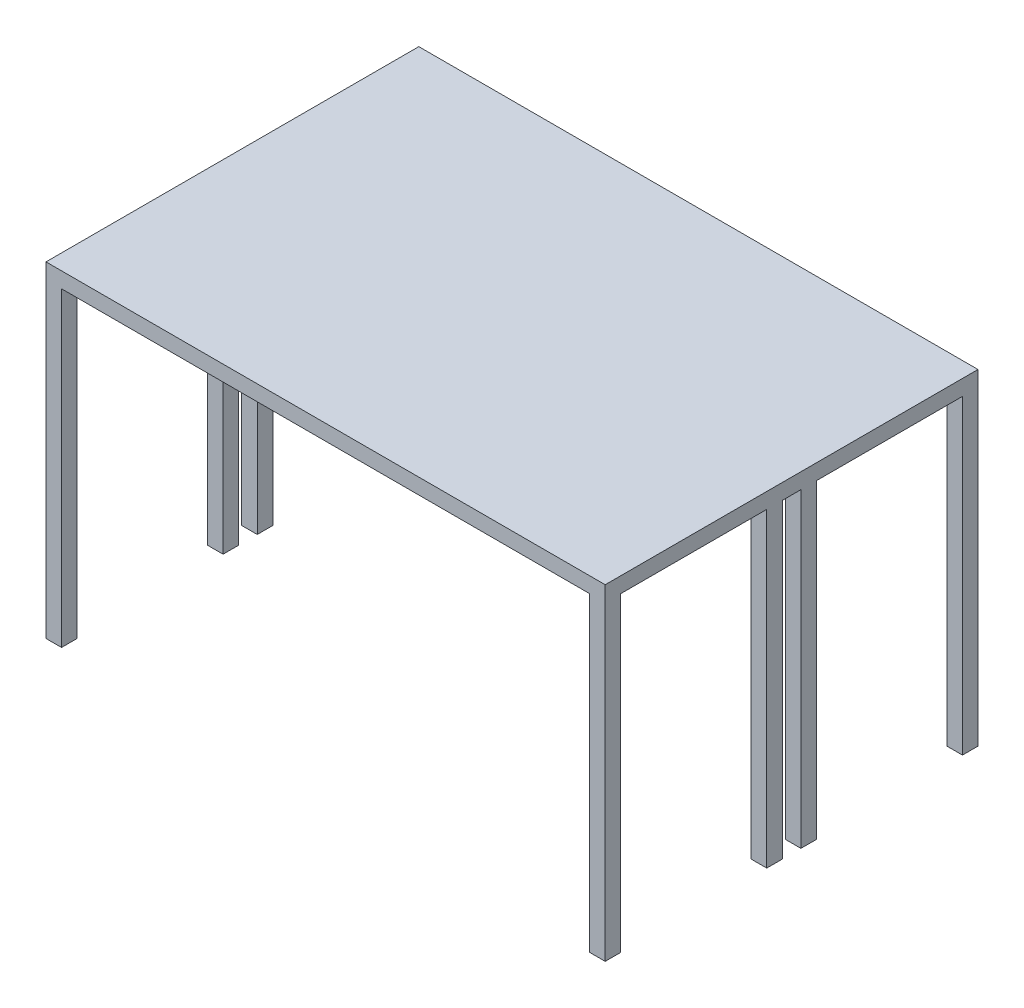
ISO-10303-21;
HEADER;
FILE_DESCRIPTION(('STEP AP214'),'2;1');
FILE_NAME('part.step','',(''),(''),'','','');
FILE_SCHEMA(('AUTOMOTIVE_DESIGN { 1 0 10303 214 1 1 1 1 }'));
ENDSEC;
DATA;
#1=APPLICATION_CONTEXT('core data for automotive mechanical design processes');
#2=APPLICATION_PROTOCOL_DEFINITION('international standard','automotive_design',2000,#1);
#3=PRODUCT_CONTEXT('',#1,'mechanical');
#4=PRODUCT('Part','Part','',(#3));
#5=PRODUCT_RELATED_PRODUCT_CATEGORY('part','',(#4));
#6=PRODUCT_DEFINITION_FORMATION('','',#4);
#7=PRODUCT_DEFINITION_CONTEXT('part definition',#1,'design');
#8=PRODUCT_DEFINITION('design','',#6,#7);
#9=PRODUCT_DEFINITION_SHAPE('','',#8);
#10=(LENGTH_UNIT() NAMED_UNIT(*) SI_UNIT(.MILLI.,.METRE.));
#11=(NAMED_UNIT(*) PLANE_ANGLE_UNIT() SI_UNIT($,.RADIAN.));
#12=(NAMED_UNIT(*) SI_UNIT($,.STERADIAN.) SOLID_ANGLE_UNIT());
#13=UNCERTAINTY_MEASURE_WITH_UNIT(LENGTH_MEASURE(1.E-05),#10,'distance_accuracy_value','');
#14=(GEOMETRIC_REPRESENTATION_CONTEXT(3) GLOBAL_UNCERTAINTY_ASSIGNED_CONTEXT((#13)) GLOBAL_UNIT_ASSIGNED_CONTEXT((#10,
#11,#12)) REPRESENTATION_CONTEXT('',''));
#15=CARTESIAN_POINT('',(0.,0.,0.));
#16=DIRECTION('',(0.,0.,1.));
#17=DIRECTION('',(1.,0.,0.));
#18=AXIS2_PLACEMENT_3D('',#15,#16,#17);
#19=CARTESIAN_POINT('',(0.,0.,0.));
#20=DIRECTION('',(0.,1.,0.));
#21=DIRECTION('',(0.,0.,1.));
#22=AXIS2_PLACEMENT_3D('',#19,#20,#21);
#23=PLANE('',#22);
#24=DIRECTION('',(-1.,0.,0.));
#25=VECTOR('',#24,1.);
#26=CARTESIAN_POINT('',(900.,0.,79.9999999999994));
#27=LINE('',#26,#25);
#28=CARTESIAN_POINT('',(900.,0.,79.9999999999994));
#29=VERTEX_POINT('',#28);
#30=CARTESIAN_POINT('',(850.,0.,79.9999999999994));
#31=VERTEX_POINT('',#30);
#32=EDGE_CURVE('E802',#29,#31,#27,.T.);
#33=ORIENTED_EDGE('',*,*,#32,.F.);
#34=DIRECTION('',(0.,0.,-1.));
#35=VECTOR('',#34,1.);
#36=CARTESIAN_POINT('',(900.,0.,-600.));
#37=LINE('',#36,#35);
#38=CARTESIAN_POINT('',(900.,0.,550.));
#39=VERTEX_POINT('',#38);
#40=EDGE_CURVE('E262',#39,#29,#37,.T.);
#41=ORIENTED_EDGE('',*,*,#40,.F.);
#42=DIRECTION('',(1.,0.,0.));
#43=VECTOR('',#42,1.);
#44=CARTESIAN_POINT('',(900.,0.,550.));
#45=LINE('',#44,#43);
#46=CARTESIAN_POINT('',(850.,0.,550.));
#47=VERTEX_POINT('',#46);
#48=EDGE_CURVE('E350',#47,#39,#45,.T.);
#49=ORIENTED_EDGE('',*,*,#48,.F.);
#50=DIRECTION('',(0.,0.,-1.));
#51=VECTOR('',#50,1.);
#52=CARTESIAN_POINT('',(850.,0.,600.));
#53=LINE('',#52,#51);
#54=CARTESIAN_POINT('',(850.,0.,600.));
#55=VERTEX_POINT('',#54);
#56=EDGE_CURVE('E345',#55,#47,#53,.T.);
#57=ORIENTED_EDGE('',*,*,#56,.F.);
#58=DIRECTION('',(1.,0.,0.));
#59=VECTOR('',#58,1.);
#60=CARTESIAN_POINT('',(-900.,0.,600.));
#61=LINE('',#60,#59);
#62=CARTESIAN_POINT('',(-850.,0.,600.));
#63=VERTEX_POINT('',#62);
#64=EDGE_CURVE('E441',#63,#55,#61,.T.);
#65=ORIENTED_EDGE('',*,*,#64,.F.);
#66=DIRECTION('',(0.,0.,1.));
#67=VECTOR('',#66,1.);
#68=CARTESIAN_POINT('',(-850.,0.,600.));
#69=LINE('',#68,#67);
#70=CARTESIAN_POINT('',(-850.,0.,550.));
#71=VERTEX_POINT('',#70);
#72=EDGE_CURVE('E371',#71,#63,#69,.T.);
#73=ORIENTED_EDGE('',*,*,#72,.F.);
#74=DIRECTION('',(1.,0.,0.));
#75=VECTOR('',#74,1.);
#76=CARTESIAN_POINT('',(-900.,0.,550.));
#77=LINE('',#76,#75);
#78=CARTESIAN_POINT('',(-900.,0.,550.));
#79=VERTEX_POINT('',#78);
#80=EDGE_CURVE('E366',#79,#71,#77,.T.);
#81=ORIENTED_EDGE('',*,*,#80,.F.);
#82=DIRECTION('',(0.,0.,1.));
#83=VECTOR('',#82,1.);
#84=CARTESIAN_POINT('',(-900.,0.,-600.));
#85=LINE('',#84,#83);
#86=CARTESIAN_POINT('',(-900.,0.,79.9999999999994));
#87=VERTEX_POINT('',#86);
#88=EDGE_CURVE('E453',#87,#79,#85,.T.);
#89=ORIENTED_EDGE('',*,*,#88,.F.);
#90=DIRECTION('',(-1.,0.,0.));
#91=VECTOR('',#90,1.);
#92=CARTESIAN_POINT('',(-900.,0.,79.9999999999994));
#93=LINE('',#92,#91);
#94=CARTESIAN_POINT('',(-850.,0.,79.9999999999994));
#95=VERTEX_POINT('',#94);
#96=EDGE_CURVE('E298',#95,#87,#93,.T.);
#97=ORIENTED_EDGE('',*,*,#96,.F.);
#98=DIRECTION('',(0.,0.,1.));
#99=VECTOR('',#98,1.);
#100=CARTESIAN_POINT('',(-850.,0.,29.9999999999994));
#101=LINE('',#100,#99);
#102=CARTESIAN_POINT('',(-850.,0.,29.9999999999994));
#103=VERTEX_POINT('',#102);
#104=EDGE_CURVE('E307',#103,#95,#101,.T.);
#105=ORIENTED_EDGE('',*,*,#104,.F.);
#106=DIRECTION('',(1.,0.,0.));
#107=VECTOR('',#106,1.);
#108=CARTESIAN_POINT('',(-900.,0.,29.9999999999994));
#109=LINE('',#108,#107);
#110=CARTESIAN_POINT('',(-900.,0.,29.9999999999994));
#111=VERTEX_POINT('',#110);
#112=EDGE_CURVE('E293',#111,#103,#109,.T.);
#113=ORIENTED_EDGE('',*,*,#112,.F.);
#114=CARTESIAN_POINT('',(-900.,0.,-29.9999999999999));
#115=VERTEX_POINT('',#114);
#116=EDGE_CURVE('E457',#115,#111,#85,.T.);
#117=ORIENTED_EDGE('',*,*,#116,.F.);
#118=DIRECTION('',(-1.,0.,0.));
#119=VECTOR('',#118,1.);
#120=CARTESIAN_POINT('',(-900.,0.,-29.9999999999999));
#121=LINE('',#120,#119);
#122=CARTESIAN_POINT('',(-850.,0.,-29.9999999999999));
#123=VERTEX_POINT('',#122);
#124=EDGE_CURVE('E324',#123,#115,#121,.T.);
#125=ORIENTED_EDGE('',*,*,#124,.F.);
#126=DIRECTION('',(0.,0.,1.));
#127=VECTOR('',#126,1.);
#128=CARTESIAN_POINT('',(-850.,0.,-29.9999999999999));
#129=LINE('',#128,#127);
#130=CARTESIAN_POINT('',(-850.,0.,-79.9999999999999));
#131=VERTEX_POINT('',#130);
#132=EDGE_CURVE('E332',#131,#123,#129,.T.);
#133=ORIENTED_EDGE('',*,*,#132,.F.);
#134=DIRECTION('',(1.,0.,0.));
#135=VECTOR('',#134,1.);
#136=CARTESIAN_POINT('',(-900.,0.,-79.9999999999999));
#137=LINE('',#136,#135);
#138=CARTESIAN_POINT('',(-900.,0.,-79.9999999999999));
#139=VERTEX_POINT('',#138);
#140=EDGE_CURVE('E319',#139,#131,#137,.T.);
#141=ORIENTED_EDGE('',*,*,#140,.F.);
#142=CARTESIAN_POINT('',(-900.,0.,-550.));
#143=VERTEX_POINT('',#142);
#144=EDGE_CURVE('E454',#143,#139,#85,.T.);
#145=ORIENTED_EDGE('',*,*,#144,.F.);
#146=DIRECTION('',(-1.,0.,0.));
#147=VECTOR('',#146,1.);
#148=CARTESIAN_POINT('',(-900.,0.,-550.));
#149=LINE('',#148,#147);
#150=CARTESIAN_POINT('',(-850.,0.,-550.));
#151=VERTEX_POINT('',#150);
#152=EDGE_CURVE('E394',#151,#143,#149,.T.);
#153=ORIENTED_EDGE('',*,*,#152,.F.);
#154=DIRECTION('',(0.,0.,1.));
#155=VECTOR('',#154,1.);
#156=CARTESIAN_POINT('',(-850.,0.,-600.));
#157=LINE('',#156,#155);
#158=CARTESIAN_POINT('',(-850.,0.,-600.));
#159=VERTEX_POINT('',#158);
#160=EDGE_CURVE('E389',#159,#151,#157,.T.);
#161=ORIENTED_EDGE('',*,*,#160,.F.);
#162=DIRECTION('',(-1.,0.,0.));
#163=VECTOR('',#162,1.);
#164=CARTESIAN_POINT('',(-900.,0.,-600.));
#165=LINE('',#164,#163);
#166=CARTESIAN_POINT('',(850.,0.,-600.));
#167=VERTEX_POINT('',#166);
#168=EDGE_CURVE('E449',#167,#159,#165,.T.);
#169=ORIENTED_EDGE('',*,*,#168,.F.);
#170=DIRECTION('',(0.,0.,-1.));
#171=VECTOR('',#170,1.);
#172=CARTESIAN_POINT('',(850.,0.,-600.));
#173=LINE('',#172,#171);
#174=CARTESIAN_POINT('',(850.,0.,-550.));
#175=VERTEX_POINT('',#174);
#176=EDGE_CURVE('E416',#175,#167,#173,.T.);
#177=ORIENTED_EDGE('',*,*,#176,.F.);
#178=DIRECTION('',(-1.,0.,0.));
#179=VECTOR('',#178,1.);
#180=CARTESIAN_POINT('',(900.,0.,-550.));
#181=LINE('',#180,#179);
#182=CARTESIAN_POINT('',(900.,0.,-550.));
#183=VERTEX_POINT('',#182);
#184=EDGE_CURVE('E411',#183,#175,#181,.T.);
#185=ORIENTED_EDGE('',*,*,#184,.F.);
#186=CARTESIAN_POINT('',(900.,0.,-79.9999999999998));
#187=VERTEX_POINT('',#186);
#188=EDGE_CURVE('E436',#187,#183,#37,.T.);
#189=ORIENTED_EDGE('',*,*,#188,.F.);
#190=DIRECTION('',(1.,0.,0.));
#191=VECTOR('',#190,1.);
#192=CARTESIAN_POINT('',(900.,0.,-79.9999999999999));
#193=LINE('',#192,#191);
#194=CARTESIAN_POINT('',(850.,0.,-79.9999999999999));
#195=VERTEX_POINT('',#194);
#196=EDGE_CURVE('E276',#195,#187,#193,.T.);
#197=ORIENTED_EDGE('',*,*,#196,.F.);
#198=DIRECTION('',(0.,0.,-1.));
#199=VECTOR('',#198,1.);
#200=CARTESIAN_POINT('',(850.,0.,-29.9999999999999));
#201=LINE('',#200,#199);
#202=CARTESIAN_POINT('',(850.,0.,-29.9999999999999));
#203=VERTEX_POINT('',#202);
#204=EDGE_CURVE('E266',#203,#195,#201,.T.);
#205=ORIENTED_EDGE('',*,*,#204,.F.);
#206=DIRECTION('',(-1.,0.,0.));
#207=VECTOR('',#206,1.);
#208=CARTESIAN_POINT('',(900.,0.,-29.9999999999999));
#209=LINE('',#208,#207);
#210=CARTESIAN_POINT('',(900.,0.,-29.9999999999999));
#211=VERTEX_POINT('',#210);
#212=EDGE_CURVE('E263',#211,#203,#209,.T.);
#213=ORIENTED_EDGE('',*,*,#212,.F.);
#214=CARTESIAN_POINT('',(900.,0.,29.9999999999995));
#215=VERTEX_POINT('',#214);
#216=EDGE_CURVE('E450',#215,#211,#37,.T.);
#217=ORIENTED_EDGE('',*,*,#216,.F.);
#218=DIRECTION('',(1.,0.,0.));
#219=VECTOR('',#218,1.);
#220=CARTESIAN_POINT('',(900.,0.,29.9999999999994));
#221=LINE('',#220,#219);
#222=CARTESIAN_POINT('',(850.,0.,29.9999999999994));
#223=VERTEX_POINT('',#222);
#224=EDGE_CURVE('E257',#223,#215,#221,.T.);
#225=ORIENTED_EDGE('',*,*,#224,.F.);
#226=DIRECTION('',(0.,0.,-1.));
#227=VECTOR('',#226,1.);
#228=CARTESIAN_POINT('',(850.,0.,29.9999999999994));
#229=LINE('',#228,#227);
#230=EDGE_CURVE('E777',#31,#223,#229,.T.);
#231=ORIENTED_EDGE('',*,*,#230,.F.);
#232=EDGE_LOOP('',(#33,#41,#49,#57,#65,#73,#81,#89,#97,#105,#113,#117,#125,#133,#141,#145,#153,
#161,#169,#177,#185,#189,#197,#205,#213,#217,#225,#231));
#233=FACE_BOUND('',#232,.T.);
#234=ADVANCED_FACE('F33',(#233),#23,.F.);
#235=CARTESIAN_POINT('',(900.,50.,-600.));
#236=DIRECTION('',(-1.,0.,0.));
#237=DIRECTION('',(0.,0.,1.));
#238=AXIS2_PLACEMENT_3D('',#235,#236,#237);
#239=PLANE('',#238);
#240=DIRECTION('',(0.,-1.,0.));
#241=VECTOR('',#240,1.);
#242=CARTESIAN_POINT('',(900.,50.,600.));
#243=LINE('',#242,#241);
#244=CARTESIAN_POINT('',(900.,50.,600.));
#245=VERTEX_POINT('',#244);
#246=CARTESIAN_POINT('',(900.,-1000.,600.));
#247=VERTEX_POINT('',#246);
#248=EDGE_CURVE('E447',#245,#247,#243,.T.);
#249=ORIENTED_EDGE('',*,*,#248,.T.);
#250=DIRECTION('',(0.,0.,1.));
#251=VECTOR('',#250,1.);
#252=CARTESIAN_POINT('',(900.,-1000.,600.));
#253=LINE('',#252,#251);
#254=CARTESIAN_POINT('',(900.,-1000.,550.));
#255=VERTEX_POINT('',#254);
#256=EDGE_CURVE('E354',#255,#247,#253,.T.);
#257=ORIENTED_EDGE('',*,*,#256,.F.);
#258=DIRECTION('',(0.,1.,0.));
#259=VECTOR('',#258,1.);
#260=CARTESIAN_POINT('',(900.,-1000.,550.));
#261=LINE('',#260,#259);
#262=EDGE_CURVE('E357',#255,#39,#261,.T.);
#263=ORIENTED_EDGE('',*,*,#262,.T.);
#264=ORIENTED_EDGE('',*,*,#40,.T.);
#265=DIRECTION('',(0.,1.,0.));
#266=VECTOR('',#265,1.);
#267=CARTESIAN_POINT('',(900.,-1000.,79.9999999999994));
#268=LINE('',#267,#266);
#269=CARTESIAN_POINT('',(900.,-1000.,79.9999999999994));
#270=VERTEX_POINT('',#269);
#271=EDGE_CURVE('E245',#270,#29,#268,.T.);
#272=ORIENTED_EDGE('',*,*,#271,.F.);
#273=DIRECTION('',(0.,0.,1.));
#274=VECTOR('',#273,1.);
#275=CARTESIAN_POINT('',(900.,-1000.,29.9999999999994));
#276=LINE('',#275,#274);
#277=CARTESIAN_POINT('',(900.,-1000.,29.9999999999994));
#278=VERTEX_POINT('',#277);
#279=EDGE_CURVE('E252',#278,#270,#276,.T.);
#280=ORIENTED_EDGE('',*,*,#279,.F.);
#281=DIRECTION('',(0.,1.,0.));
#282=VECTOR('',#281,1.);
#283=CARTESIAN_POINT('',(900.,-1000.,29.9999999999994));
#284=LINE('',#283,#282);
#285=EDGE_CURVE('E48',#278,#215,#284,.T.);
#286=ORIENTED_EDGE('',*,*,#285,.T.);
#287=ORIENTED_EDGE('',*,*,#216,.T.);
#288=DIRECTION('',(0.,1.,0.));
#289=VECTOR('',#288,1.);
#290=CARTESIAN_POINT('',(900.,-1000.,-29.9999999999999));
#291=LINE('',#290,#289);
#292=CARTESIAN_POINT('',(900.,-1000.,-29.9999999999999));
#293=VERTEX_POINT('',#292);
#294=EDGE_CURVE('E281',#293,#211,#291,.T.);
#295=ORIENTED_EDGE('',*,*,#294,.F.);
#296=DIRECTION('',(0.,0.,1.));
#297=VECTOR('',#296,1.);
#298=CARTESIAN_POINT('',(900.,-1000.,-29.9999999999999));
#299=LINE('',#298,#297);
#300=CARTESIAN_POINT('',(900.,-1000.,-79.9999999999999));
#301=VERTEX_POINT('',#300);
#302=EDGE_CURVE('E280',#301,#293,#299,.T.);
#303=ORIENTED_EDGE('',*,*,#302,.F.);
#304=DIRECTION('',(0.,1.,0.));
#305=VECTOR('',#304,1.);
#306=CARTESIAN_POINT('',(900.,-1000.,-79.9999999999999));
#307=LINE('',#306,#305);
#308=EDGE_CURVE('E55',#301,#187,#307,.T.);
#309=ORIENTED_EDGE('',*,*,#308,.T.);
#310=ORIENTED_EDGE('',*,*,#188,.T.);
#311=DIRECTION('',(0.,1.,0.));
#312=VECTOR('',#311,1.);
#313=CARTESIAN_POINT('',(900.,-1000.,-550.));
#314=LINE('',#313,#312);
#315=CARTESIAN_POINT('',(900.,-1000.,-550.));
#316=VERTEX_POINT('',#315);
#317=EDGE_CURVE('E433',#316,#183,#314,.T.);
#318=ORIENTED_EDGE('',*,*,#317,.F.);
#319=DIRECTION('',(0.,0.,1.));
#320=VECTOR('',#319,1.);
#321=CARTESIAN_POINT('',(900.,-1000.,-600.));
#322=LINE('',#321,#320);
#323=CARTESIAN_POINT('',(900.,-1000.,-600.));
#324=VERTEX_POINT('',#323);
#325=EDGE_CURVE('E412',#324,#316,#322,.T.);
#326=ORIENTED_EDGE('',*,*,#325,.F.);
#327=DIRECTION('',(0.,-1.,0.));
#328=VECTOR('',#327,1.);
#329=CARTESIAN_POINT('',(900.,50.,-600.));
#330=LINE('',#329,#328);
#331=CARTESIAN_POINT('',(900.,50.,-600.));
#332=VERTEX_POINT('',#331);
#333=EDGE_CURVE('E11',#332,#324,#330,.T.);
#334=ORIENTED_EDGE('',*,*,#333,.F.);
#335=DIRECTION('',(0.,0.,-1.));
#336=VECTOR('',#335,1.);
#337=CARTESIAN_POINT('',(900.,50.,-600.));
#338=LINE('',#337,#336);
#339=EDGE_CURVE('E437',#245,#332,#338,.T.);
#340=ORIENTED_EDGE('',*,*,#339,.F.);
#341=EDGE_LOOP('',(#249,#257,#263,#264,#272,#280,#286,#287,#295,#303,#309,#310,#318,#326,#334,#340));
#342=FACE_BOUND('',#341,.T.);
#343=ADVANCED_FACE('F35',(#342),#239,.F.);
#344=CARTESIAN_POINT('',(-900.,50.,-600.));
#345=DIRECTION('',(0.,0.,1.));
#346=DIRECTION('',(1.,0.,0.));
#347=AXIS2_PLACEMENT_3D('',#344,#345,#346);
#348=PLANE('',#347);
#349=ORIENTED_EDGE('',*,*,#333,.T.);
#350=DIRECTION('',(1.,0.,0.));
#351=VECTOR('',#350,1.);
#352=CARTESIAN_POINT('',(900.,-1000.,-600.));
#353=LINE('',#352,#351);
#354=CARTESIAN_POINT('',(850.,-1000.,-600.));
#355=VERTEX_POINT('',#354);
#356=EDGE_CURVE('E420',#355,#324,#353,.T.);
#357=ORIENTED_EDGE('',*,*,#356,.F.);
#358=DIRECTION('',(0.,1.,0.));
#359=VECTOR('',#358,1.);
#360=CARTESIAN_POINT('',(850.,-1000.,-600.));
#361=LINE('',#360,#359);
#362=EDGE_CURVE('E423',#355,#167,#361,.T.);
#363=ORIENTED_EDGE('',*,*,#362,.T.);
#364=ORIENTED_EDGE('',*,*,#168,.T.);
#365=DIRECTION('',(0.,1.,0.));
#366=VECTOR('',#365,1.);
#367=CARTESIAN_POINT('',(-850.,-1000.,-600.));
#368=LINE('',#367,#366);
#369=CARTESIAN_POINT('',(-850.,-1000.,-600.));
#370=VERTEX_POINT('',#369);
#371=EDGE_CURVE('E409',#370,#159,#368,.T.);
#372=ORIENTED_EDGE('',*,*,#371,.F.);
#373=DIRECTION('',(1.,0.,0.));
#374=VECTOR('',#373,1.);
#375=CARTESIAN_POINT('',(-900.,-1000.,-600.));
#376=LINE('',#375,#374);
#377=CARTESIAN_POINT('',(-900.,-1000.,-600.));
#378=VERTEX_POINT('',#377);
#379=EDGE_CURVE('E390',#378,#370,#376,.T.);
#380=ORIENTED_EDGE('',*,*,#379,.F.);
#381=DIRECTION('',(0.,-1.,0.));
#382=VECTOR('',#381,1.);
#383=CARTESIAN_POINT('',(-900.,50.,-600.));
#384=LINE('',#383,#382);
#385=CARTESIAN_POINT('',(-900.,50.,-600.));
#386=VERTEX_POINT('',#385);
#387=EDGE_CURVE('E41',#386,#378,#384,.T.);
#388=ORIENTED_EDGE('',*,*,#387,.F.);
#389=DIRECTION('',(-1.,0.,0.));
#390=VECTOR('',#389,1.);
#391=CARTESIAN_POINT('',(-900.,50.,-600.));
#392=LINE('',#391,#390);
#393=EDGE_CURVE('E440',#332,#386,#392,.T.);
#394=ORIENTED_EDGE('',*,*,#393,.F.);
#395=EDGE_LOOP('',(#349,#357,#363,#364,#372,#380,#388,#394));
#396=FACE_BOUND('',#395,.T.);
#397=ADVANCED_FACE('F475',(#396),#348,.F.);
#398=CARTESIAN_POINT('',(-900.,50.,-600.));
#399=DIRECTION('',(1.,0.,0.));
#400=DIRECTION('',(0.,0.,-1.));
#401=AXIS2_PLACEMENT_3D('',#398,#399,#400);
#402=PLANE('',#401);
#403=ORIENTED_EDGE('',*,*,#387,.T.);
#404=DIRECTION('',(0.,0.,-1.));
#405=VECTOR('',#404,1.);
#406=CARTESIAN_POINT('',(-900.,-1000.,-600.));
#407=LINE('',#406,#405);
#408=CARTESIAN_POINT('',(-900.,-1000.,-550.));
#409=VERTEX_POINT('',#408);
#410=EDGE_CURVE('E398',#409,#378,#407,.T.);
#411=ORIENTED_EDGE('',*,*,#410,.F.);
#412=DIRECTION('',(0.,1.,0.));
#413=VECTOR('',#412,1.);
#414=CARTESIAN_POINT('',(-900.,-1000.,-550.));
#415=LINE('',#414,#413);
#416=EDGE_CURVE('E401',#409,#143,#415,.T.);
#417=ORIENTED_EDGE('',*,*,#416,.T.);
#418=ORIENTED_EDGE('',*,*,#144,.T.);
#419=DIRECTION('',(0.,1.,0.));
#420=VECTOR('',#419,1.);
#421=CARTESIAN_POINT('',(-900.,-1000.,-79.9999999999999));
#422=LINE('',#421,#420);
#423=CARTESIAN_POINT('',(-900.,-1000.,-79.9999999999999));
#424=VERTEX_POINT('',#423);
#425=EDGE_CURVE('E343',#424,#139,#422,.T.);
#426=ORIENTED_EDGE('',*,*,#425,.F.);
#427=DIRECTION('',(0.,0.,-1.));
#428=VECTOR('',#427,1.);
#429=CARTESIAN_POINT('',(-900.,-1000.,-29.9999999999999));
#430=LINE('',#429,#428);
#431=CARTESIAN_POINT('',(-900.,-1000.,-29.9999999999999));
#432=VERTEX_POINT('',#431);
#433=EDGE_CURVE('E320',#432,#424,#430,.T.);
#434=ORIENTED_EDGE('',*,*,#433,.F.);
#435=DIRECTION('',(0.,1.,0.));
#436=VECTOR('',#435,1.);
#437=CARTESIAN_POINT('',(-900.,-1000.,-29.9999999999999));
#438=LINE('',#437,#436);
#439=EDGE_CURVE('E330',#432,#115,#438,.T.);
#440=ORIENTED_EDGE('',*,*,#439,.T.);
#441=ORIENTED_EDGE('',*,*,#116,.T.);
#442=DIRECTION('',(0.,1.,0.));
#443=VECTOR('',#442,1.);
#444=CARTESIAN_POINT('',(-900.,-1000.,29.9999999999994));
#445=LINE('',#444,#443);
#446=CARTESIAN_POINT('',(-900.,-1000.,29.9999999999994));
#447=VERTEX_POINT('',#446);
#448=EDGE_CURVE('E304',#447,#111,#445,.T.);
#449=ORIENTED_EDGE('',*,*,#448,.F.);
#450=DIRECTION('',(0.,0.,-1.));
#451=VECTOR('',#450,1.);
#452=CARTESIAN_POINT('',(-900.,-1000.,29.9999999999994));
#453=LINE('',#452,#451);
#454=CARTESIAN_POINT('',(-900.,-1000.,79.9999999999994));
#455=VERTEX_POINT('',#454);
#456=EDGE_CURVE('E302',#455,#447,#453,.T.);
#457=ORIENTED_EDGE('',*,*,#456,.F.);
#458=DIRECTION('',(0.,1.,0.));
#459=VECTOR('',#458,1.);
#460=CARTESIAN_POINT('',(-900.,-1000.,79.9999999999994));
#461=LINE('',#460,#459);
#462=EDGE_CURVE('E312',#455,#87,#461,.T.);
#463=ORIENTED_EDGE('',*,*,#462,.T.);
#464=ORIENTED_EDGE('',*,*,#88,.T.);
#465=DIRECTION('',(0.,1.,0.));
#466=VECTOR('',#465,1.);
#467=CARTESIAN_POINT('',(-900.,-1000.,550.));
#468=LINE('',#467,#466);
#469=CARTESIAN_POINT('',(-900.,-1000.,550.));
#470=VERTEX_POINT('',#469);
#471=EDGE_CURVE('E386',#470,#79,#468,.T.);
#472=ORIENTED_EDGE('',*,*,#471,.F.);
#473=DIRECTION('',(0.,0.,-1.));
#474=VECTOR('',#473,1.);
#475=CARTESIAN_POINT('',(-900.,-1000.,600.));
#476=LINE('',#475,#474);
#477=CARTESIAN_POINT('',(-900.,-1000.,600.));
#478=VERTEX_POINT('',#477);
#479=EDGE_CURVE('E367',#478,#470,#476,.T.);
#480=ORIENTED_EDGE('',*,*,#479,.F.);
#481=DIRECTION('',(0.,-1.,0.));
#482=VECTOR('',#481,1.);
#483=CARTESIAN_POINT('',(-900.,50.,600.));
#484=LINE('',#483,#482);
#485=CARTESIAN_POINT('',(-900.,50.,600.));
#486=VERTEX_POINT('',#485);
#487=EDGE_CURVE('E461',#486,#478,#484,.T.);
#488=ORIENTED_EDGE('',*,*,#487,.F.);
#489=DIRECTION('',(0.,0.,1.));
#490=VECTOR('',#489,1.);
#491=CARTESIAN_POINT('',(-900.,50.,-600.));
#492=LINE('',#491,#490);
#493=EDGE_CURVE('E443',#386,#486,#492,.T.);
#494=ORIENTED_EDGE('',*,*,#493,.F.);
#495=EDGE_LOOP('',(#403,#411,#417,#418,#426,#434,#440,#441,#449,#457,#463,#464,#472,#480,#488,#494));
#496=FACE_BOUND('',#495,.T.);
#497=ADVANCED_FACE('F466',(#496),#402,.F.);
#498=CARTESIAN_POINT('',(-900.,50.,600.));
#499=DIRECTION('',(0.,0.,-1.));
#500=DIRECTION('',(-1.,0.,0.));
#501=AXIS2_PLACEMENT_3D('',#498,#499,#500);
#502=PLANE('',#501);
#503=ORIENTED_EDGE('',*,*,#487,.T.);
#504=DIRECTION('',(-1.,0.,0.));
#505=VECTOR('',#504,1.);
#506=CARTESIAN_POINT('',(-900.,-1000.,600.));
#507=LINE('',#506,#505);
#508=CARTESIAN_POINT('',(-850.,-1000.,600.));
#509=VERTEX_POINT('',#508);
#510=EDGE_CURVE('E375',#509,#478,#507,.T.);
#511=ORIENTED_EDGE('',*,*,#510,.F.);
#512=DIRECTION('',(0.,1.,0.));
#513=VECTOR('',#512,1.);
#514=CARTESIAN_POINT('',(-850.,-1000.,600.));
#515=LINE('',#514,#513);
#516=EDGE_CURVE('E378',#509,#63,#515,.T.);
#517=ORIENTED_EDGE('',*,*,#516,.T.);
#518=ORIENTED_EDGE('',*,*,#64,.T.);
#519=DIRECTION('',(0.,1.,0.));
#520=VECTOR('',#519,1.);
#521=CARTESIAN_POINT('',(850.,-1000.,600.));
#522=LINE('',#521,#520);
#523=CARTESIAN_POINT('',(850.,-1000.,600.));
#524=VERTEX_POINT('',#523);
#525=EDGE_CURVE('E364',#524,#55,#522,.T.);
#526=ORIENTED_EDGE('',*,*,#525,.F.);
#527=DIRECTION('',(-1.,0.,0.));
#528=VECTOR('',#527,1.);
#529=CARTESIAN_POINT('',(900.,-1000.,600.));
#530=LINE('',#529,#528);
#531=EDGE_CURVE('E346',#247,#524,#530,.T.);
#532=ORIENTED_EDGE('',*,*,#531,.F.);
#533=ORIENTED_EDGE('',*,*,#248,.F.);
#534=DIRECTION('',(1.,0.,0.));
#535=VECTOR('',#534,1.);
#536=CARTESIAN_POINT('',(-900.,50.,600.));
#537=LINE('',#536,#535);
#538=EDGE_CURVE('E445',#486,#245,#537,.T.);
#539=ORIENTED_EDGE('',*,*,#538,.F.);
#540=EDGE_LOOP('',(#503,#511,#517,#518,#526,#532,#533,#539));
#541=FACE_BOUND('',#540,.T.);
#542=ADVANCED_FACE('F524',(#541),#502,.F.);
#543=CARTESIAN_POINT('',(0.,50.,0.));
#544=DIRECTION('',(0.,1.,0.));
#545=DIRECTION('',(0.,0.,1.));
#546=AXIS2_PLACEMENT_3D('',#543,#544,#545);
#547=PLANE('',#546);
#548=ORIENTED_EDGE('',*,*,#339,.T.);
#549=ORIENTED_EDGE('',*,*,#393,.T.);
#550=ORIENTED_EDGE('',*,*,#493,.T.);
#551=ORIENTED_EDGE('',*,*,#538,.T.);
#552=EDGE_LOOP('',(#548,#549,#550,#551));
#553=FACE_BOUND('',#552,.T.);
#554=ADVANCED_FACE('F522',(#553),#547,.T.);
#555=CARTESIAN_POINT('',(900.,-1000.,-550.));
#556=DIRECTION('',(0.,0.,-1.));
#557=DIRECTION('',(-1.,0.,0.));
#558=AXIS2_PLACEMENT_3D('',#555,#556,#557);
#559=PLANE('',#558);
#560=ORIENTED_EDGE('',*,*,#184,.T.);
#561=DIRECTION('',(0.,1.,0.));
#562=VECTOR('',#561,1.);
#563=CARTESIAN_POINT('',(850.,-1000.,-550.));
#564=LINE('',#563,#562);
#565=CARTESIAN_POINT('',(850.,-1000.,-550.));
#566=VERTEX_POINT('',#565);
#567=EDGE_CURVE('E430',#566,#175,#564,.T.);
#568=ORIENTED_EDGE('',*,*,#567,.F.);
#569=DIRECTION('',(-1.,0.,0.));
#570=VECTOR('',#569,1.);
#571=CARTESIAN_POINT('',(900.,-1000.,-550.));
#572=LINE('',#571,#570);
#573=EDGE_CURVE('E415',#316,#566,#572,.T.);
#574=ORIENTED_EDGE('',*,*,#573,.F.);
#575=ORIENTED_EDGE('',*,*,#317,.T.);
#576=EDGE_LOOP('',(#560,#568,#574,#575));
#577=FACE_BOUND('',#576,.T.);
#578=ADVANCED_FACE('F549',(#577),#559,.F.);
#579=CARTESIAN_POINT('',(850.,-1000.,-600.));
#580=DIRECTION('',(1.,0.,0.));
#581=DIRECTION('',(0.,0.,-1.));
#582=AXIS2_PLACEMENT_3D('',#579,#580,#581);
#583=PLANE('',#582);
#584=ORIENTED_EDGE('',*,*,#176,.T.);
#585=ORIENTED_EDGE('',*,*,#362,.F.);
#586=DIRECTION('',(0.,0.,-1.));
#587=VECTOR('',#586,1.);
#588=CARTESIAN_POINT('',(850.,-1000.,-600.));
#589=LINE('',#588,#587);
#590=EDGE_CURVE('E418',#566,#355,#589,.T.);
#591=ORIENTED_EDGE('',*,*,#590,.F.);
#592=ORIENTED_EDGE('',*,*,#567,.T.);
#593=EDGE_LOOP('',(#584,#585,#591,#592));
#594=FACE_BOUND('',#593,.T.);
#595=ADVANCED_FACE('F555',(#594),#583,.F.);
#596=CARTESIAN_POINT('',(0.,-1000.,0.));
#597=DIRECTION('',(0.,-1.,0.));
#598=DIRECTION('',(0.,0.,-1.));
#599=AXIS2_PLACEMENT_3D('',#596,#597,#598);
#600=PLANE('',#599);
#601=ORIENTED_EDGE('',*,*,#325,.T.);
#602=ORIENTED_EDGE('',*,*,#573,.T.);
#603=ORIENTED_EDGE('',*,*,#590,.T.);
#604=ORIENTED_EDGE('',*,*,#356,.T.);
#605=EDGE_LOOP('',(#601,#602,#603,#604));
#606=FACE_BOUND('',#605,.T.);
#607=ADVANCED_FACE('F562',(#606),#600,.T.);
#608=CARTESIAN_POINT('',(-850.,-1000.,-600.));
#609=DIRECTION('',(-1.,0.,0.));
#610=DIRECTION('',(0.,0.,1.));
#611=AXIS2_PLACEMENT_3D('',#608,#609,#610);
#612=PLANE('',#611);
#613=ORIENTED_EDGE('',*,*,#160,.T.);
#614=DIRECTION('',(0.,1.,0.));
#615=VECTOR('',#614,1.);
#616=CARTESIAN_POINT('',(-850.,-1000.,-550.));
#617=LINE('',#616,#615);
#618=CARTESIAN_POINT('',(-850.,-1000.,-550.));
#619=VERTEX_POINT('',#618);
#620=EDGE_CURVE('E406',#619,#151,#617,.T.);
#621=ORIENTED_EDGE('',*,*,#620,.F.);
#622=DIRECTION('',(0.,0.,1.));
#623=VECTOR('',#622,1.);
#624=CARTESIAN_POINT('',(-850.,-1000.,-600.));
#625=LINE('',#624,#623);
#626=EDGE_CURVE('E393',#370,#619,#625,.T.);
#627=ORIENTED_EDGE('',*,*,#626,.F.);
#628=ORIENTED_EDGE('',*,*,#371,.T.);
#629=EDGE_LOOP('',(#613,#621,#627,#628));
#630=FACE_BOUND('',#629,.T.);
#631=ADVANCED_FACE('F478',(#630),#612,.F.);
#632=CARTESIAN_POINT('',(-900.,-1000.,-550.));
#633=DIRECTION('',(0.,0.,-1.));
#634=DIRECTION('',(-1.,0.,0.));
#635=AXIS2_PLACEMENT_3D('',#632,#633,#634);
#636=PLANE('',#635);
#637=ORIENTED_EDGE('',*,*,#152,.T.);
#638=ORIENTED_EDGE('',*,*,#416,.F.);
#639=DIRECTION('',(-1.,0.,0.));
#640=VECTOR('',#639,1.);
#641=CARTESIAN_POINT('',(-900.,-1000.,-550.));
#642=LINE('',#641,#640);
#643=EDGE_CURVE('E396',#619,#409,#642,.T.);
#644=ORIENTED_EDGE('',*,*,#643,.F.);
#645=ORIENTED_EDGE('',*,*,#620,.T.);
#646=EDGE_LOOP('',(#637,#638,#644,#645));
#647=FACE_BOUND('',#646,.T.);
#648=ADVANCED_FACE('F485',(#647),#636,.F.);
#649=CARTESIAN_POINT('',(0.,-1000.,0.));
#650=DIRECTION('',(0.,-1.,0.));
#651=DIRECTION('',(0.,0.,-1.));
#652=AXIS2_PLACEMENT_3D('',#649,#650,#651);
#653=PLANE('',#652);
#654=ORIENTED_EDGE('',*,*,#379,.T.);
#655=ORIENTED_EDGE('',*,*,#626,.T.);
#656=ORIENTED_EDGE('',*,*,#643,.T.);
#657=ORIENTED_EDGE('',*,*,#410,.T.);
#658=EDGE_LOOP('',(#654,#655,#656,#657));
#659=FACE_BOUND('',#658,.T.);
#660=ADVANCED_FACE('F471',(#659),#653,.T.);
#661=CARTESIAN_POINT('',(-900.,-1000.,550.));
#662=DIRECTION('',(0.,0.,1.));
#663=DIRECTION('',(1.,0.,0.));
#664=AXIS2_PLACEMENT_3D('',#661,#662,#663);
#665=PLANE('',#664);
#666=ORIENTED_EDGE('',*,*,#80,.T.);
#667=DIRECTION('',(0.,1.,0.));
#668=VECTOR('',#667,1.);
#669=CARTESIAN_POINT('',(-850.,-1000.,550.));
#670=LINE('',#669,#668);
#671=CARTESIAN_POINT('',(-850.,-1000.,550.));
#672=VERTEX_POINT('',#671);
#673=EDGE_CURVE('E383',#672,#71,#670,.T.);
#674=ORIENTED_EDGE('',*,*,#673,.F.);
#675=DIRECTION('',(1.,0.,0.));
#676=VECTOR('',#675,1.);
#677=CARTESIAN_POINT('',(-900.,-1000.,550.));
#678=LINE('',#677,#676);
#679=EDGE_CURVE('E370',#470,#672,#678,.T.);
#680=ORIENTED_EDGE('',*,*,#679,.F.);
#681=ORIENTED_EDGE('',*,*,#471,.T.);
#682=EDGE_LOOP('',(#666,#674,#680,#681));
#683=FACE_BOUND('',#682,.T.);
#684=ADVANCED_FACE('F589',(#683),#665,.F.);
#685=CARTESIAN_POINT('',(-850.,-1000.,600.));
#686=DIRECTION('',(-1.,0.,0.));
#687=DIRECTION('',(0.,0.,1.));
#688=AXIS2_PLACEMENT_3D('',#685,#686,#687);
#689=PLANE('',#688);
#690=ORIENTED_EDGE('',*,*,#72,.T.);
#691=ORIENTED_EDGE('',*,*,#516,.F.);
#692=DIRECTION('',(0.,0.,1.));
#693=VECTOR('',#692,1.);
#694=CARTESIAN_POINT('',(-850.,-1000.,600.));
#695=LINE('',#694,#693);
#696=EDGE_CURVE('E373',#672,#509,#695,.T.);
#697=ORIENTED_EDGE('',*,*,#696,.F.);
#698=ORIENTED_EDGE('',*,*,#673,.T.);
#699=EDGE_LOOP('',(#690,#691,#697,#698));
#700=FACE_BOUND('',#699,.T.);
#701=ADVANCED_FACE('F596',(#700),#689,.F.);
#702=CARTESIAN_POINT('',(0.,-1000.,0.));
#703=DIRECTION('',(0.,-1.,0.));
#704=DIRECTION('',(0.,0.,-1.));
#705=AXIS2_PLACEMENT_3D('',#702,#703,#704);
#706=PLANE('',#705);
#707=ORIENTED_EDGE('',*,*,#479,.T.);
#708=ORIENTED_EDGE('',*,*,#679,.T.);
#709=ORIENTED_EDGE('',*,*,#696,.T.);
#710=ORIENTED_EDGE('',*,*,#510,.T.);
#711=EDGE_LOOP('',(#707,#708,#709,#710));
#712=FACE_BOUND('',#711,.T.);
#713=ADVANCED_FACE('F604',(#712),#706,.T.);
#714=CARTESIAN_POINT('',(850.,-1000.,600.));
#715=DIRECTION('',(1.,0.,0.));
#716=DIRECTION('',(0.,0.,-1.));
#717=AXIS2_PLACEMENT_3D('',#714,#715,#716);
#718=PLANE('',#717);
#719=ORIENTED_EDGE('',*,*,#56,.T.);
#720=DIRECTION('',(0.,1.,0.));
#721=VECTOR('',#720,1.);
#722=CARTESIAN_POINT('',(850.,-1000.,550.));
#723=LINE('',#722,#721);
#724=CARTESIAN_POINT('',(850.,-1000.,550.));
#725=VERTEX_POINT('',#724);
#726=EDGE_CURVE('E361',#725,#47,#723,.T.);
#727=ORIENTED_EDGE('',*,*,#726,.F.);
#728=DIRECTION('',(0.,0.,-1.));
#729=VECTOR('',#728,1.);
#730=CARTESIAN_POINT('',(850.,-1000.,600.));
#731=LINE('',#730,#729);
#732=EDGE_CURVE('E349',#524,#725,#731,.T.);
#733=ORIENTED_EDGE('',*,*,#732,.F.);
#734=ORIENTED_EDGE('',*,*,#525,.T.);
#735=EDGE_LOOP('',(#719,#727,#733,#734));
#736=FACE_BOUND('',#735,.T.);
#737=ADVANCED_FACE('F612',(#736),#718,.F.);
#738=CARTESIAN_POINT('',(900.,-1000.,550.));
#739=DIRECTION('',(0.,0.,1.));
#740=DIRECTION('',(1.,0.,0.));
#741=AXIS2_PLACEMENT_3D('',#738,#739,#740);
#742=PLANE('',#741);
#743=ORIENTED_EDGE('',*,*,#48,.T.);
#744=ORIENTED_EDGE('',*,*,#262,.F.);
#745=DIRECTION('',(1.,0.,0.));
#746=VECTOR('',#745,1.);
#747=CARTESIAN_POINT('',(900.,-1000.,550.));
#748=LINE('',#747,#746);
#749=EDGE_CURVE('E352',#725,#255,#748,.T.);
#750=ORIENTED_EDGE('',*,*,#749,.F.);
#751=ORIENTED_EDGE('',*,*,#726,.T.);
#752=EDGE_LOOP('',(#743,#744,#750,#751));
#753=FACE_BOUND('',#752,.T.);
#754=ADVANCED_FACE('F620',(#753),#742,.F.);
#755=CARTESIAN_POINT('',(0.,-1000.,0.));
#756=DIRECTION('',(0.,-1.,0.));
#757=DIRECTION('',(0.,0.,-1.));
#758=AXIS2_PLACEMENT_3D('',#755,#756,#757);
#759=PLANE('',#758);
#760=ORIENTED_EDGE('',*,*,#531,.T.);
#761=ORIENTED_EDGE('',*,*,#732,.T.);
#762=ORIENTED_EDGE('',*,*,#749,.T.);
#763=ORIENTED_EDGE('',*,*,#256,.T.);
#764=EDGE_LOOP('',(#760,#761,#762,#763));
#765=FACE_BOUND('',#764,.T.);
#766=ADVANCED_FACE('F628',(#765),#759,.T.);
#767=CARTESIAN_POINT('',(-900.,-1000.,-79.9999999999999));
#768=DIRECTION('',(0.,0.,1.));
#769=DIRECTION('',(1.,0.,0.));
#770=AXIS2_PLACEMENT_3D('',#767,#768,#769);
#771=PLANE('',#770);
#772=ORIENTED_EDGE('',*,*,#140,.T.);
#773=DIRECTION('',(0.,1.,0.));
#774=VECTOR('',#773,1.);
#775=CARTESIAN_POINT('',(-850.,-1000.,-79.9999999999999));
#776=LINE('',#775,#774);
#777=CARTESIAN_POINT('',(-850.,-1000.,-79.9999999999999));
#778=VERTEX_POINT('',#777);
#779=EDGE_CURVE('E340',#778,#131,#776,.T.);
#780=ORIENTED_EDGE('',*,*,#779,.F.);
#781=DIRECTION('',(1.,0.,0.));
#782=VECTOR('',#781,1.);
#783=CARTESIAN_POINT('',(-900.,-1000.,-79.9999999999999));
#784=LINE('',#783,#782);
#785=EDGE_CURVE('E323',#424,#778,#784,.T.);
#786=ORIENTED_EDGE('',*,*,#785,.F.);
#787=ORIENTED_EDGE('',*,*,#425,.T.);
#788=EDGE_LOOP('',(#772,#780,#786,#787));
#789=FACE_BOUND('',#788,.T.);
#790=ADVANCED_FACE('F489',(#789),#771,.F.);
#791=CARTESIAN_POINT('',(-850.,-1000.,-29.9999999999999));
#792=DIRECTION('',(-1.,0.,0.));
#793=DIRECTION('',(0.,0.,1.));
#794=AXIS2_PLACEMENT_3D('',#791,#792,#793);
#795=PLANE('',#794);
#796=ORIENTED_EDGE('',*,*,#132,.T.);
#797=DIRECTION('',(0.,1.,0.));
#798=VECTOR('',#797,1.);
#799=CARTESIAN_POINT('',(-850.,-1000.,-29.9999999999999));
#800=LINE('',#799,#798);
#801=CARTESIAN_POINT('',(-850.,-1000.,-29.9999999999999));
#802=VERTEX_POINT('',#801);
#803=EDGE_CURVE('E337',#802,#123,#800,.T.);
#804=ORIENTED_EDGE('',*,*,#803,.F.);
#805=DIRECTION('',(0.,0.,1.));
#806=VECTOR('',#805,1.);
#807=CARTESIAN_POINT('',(-850.,-1000.,-29.9999999999999));
#808=LINE('',#807,#806);
#809=EDGE_CURVE('E326',#778,#802,#808,.T.);
#810=ORIENTED_EDGE('',*,*,#809,.F.);
#811=ORIENTED_EDGE('',*,*,#779,.T.);
#812=EDGE_LOOP('',(#796,#804,#810,#811));
#813=FACE_BOUND('',#812,.T.);
#814=ADVANCED_FACE('F496',(#813),#795,.F.);
#815=CARTESIAN_POINT('',(-900.,-1000.,-29.9999999999999));
#816=DIRECTION('',(0.,0.,-1.));
#817=DIRECTION('',(-1.,0.,0.));
#818=AXIS2_PLACEMENT_3D('',#815,#816,#817);
#819=PLANE('',#818);
#820=ORIENTED_EDGE('',*,*,#124,.T.);
#821=ORIENTED_EDGE('',*,*,#439,.F.);
#822=DIRECTION('',(-1.,0.,0.));
#823=VECTOR('',#822,1.);
#824=CARTESIAN_POINT('',(-900.,-1000.,-29.9999999999999));
#825=LINE('',#824,#823);
#826=EDGE_CURVE('E328',#802,#432,#825,.T.);
#827=ORIENTED_EDGE('',*,*,#826,.F.);
#828=ORIENTED_EDGE('',*,*,#803,.T.);
#829=EDGE_LOOP('',(#820,#821,#827,#828));
#830=FACE_BOUND('',#829,.T.);
#831=ADVANCED_FACE('F500',(#830),#819,.F.);
#832=CARTESIAN_POINT('',(0.,-1000.,0.));
#833=DIRECTION('',(0.,-1.,0.));
#834=DIRECTION('',(0.,0.,-1.));
#835=AXIS2_PLACEMENT_3D('',#832,#833,#834);
#836=PLANE('',#835);
#837=ORIENTED_EDGE('',*,*,#433,.T.);
#838=ORIENTED_EDGE('',*,*,#785,.T.);
#839=ORIENTED_EDGE('',*,*,#809,.T.);
#840=ORIENTED_EDGE('',*,*,#826,.T.);
#841=EDGE_LOOP('',(#837,#838,#839,#840));
#842=FACE_BOUND('',#841,.T.);
#843=ADVANCED_FACE('F503',(#842),#836,.T.);
#844=CARTESIAN_POINT('',(-900.,-1000.,29.9999999999994));
#845=DIRECTION('',(0.,0.,1.));
#846=DIRECTION('',(1.,0.,0.));
#847=AXIS2_PLACEMENT_3D('',#844,#845,#846);
#848=PLANE('',#847);
#849=ORIENTED_EDGE('',*,*,#112,.T.);
#850=DIRECTION('',(0.,1.,0.));
#851=VECTOR('',#850,1.);
#852=CARTESIAN_POINT('',(-850.,-1000.,29.9999999999994));
#853=LINE('',#852,#851);
#854=CARTESIAN_POINT('',(-850.,-1000.,29.9999999999994));
#855=VERTEX_POINT('',#854);
#856=EDGE_CURVE('E317',#855,#103,#853,.T.);
#857=ORIENTED_EDGE('',*,*,#856,.F.);
#858=DIRECTION('',(1.,0.,0.));
#859=VECTOR('',#858,1.);
#860=CARTESIAN_POINT('',(-900.,-1000.,29.9999999999994));
#861=LINE('',#860,#859);
#862=EDGE_CURVE('E294',#447,#855,#861,.T.);
#863=ORIENTED_EDGE('',*,*,#862,.F.);
#864=ORIENTED_EDGE('',*,*,#448,.T.);
#865=EDGE_LOOP('',(#849,#857,#863,#864));
#866=FACE_BOUND('',#865,.T.);
#867=ADVANCED_FACE('F505',(#866),#848,.F.);
#868=CARTESIAN_POINT('',(-850.,-1000.,29.9999999999994));
#869=DIRECTION('',(-1.,0.,0.));
#870=DIRECTION('',(0.,0.,1.));
#871=AXIS2_PLACEMENT_3D('',#868,#869,#870);
#872=PLANE('',#871);
#873=ORIENTED_EDGE('',*,*,#104,.T.);
#874=DIRECTION('',(0.,1.,0.));
#875=VECTOR('',#874,1.);
#876=CARTESIAN_POINT('',(-850.,-1000.,79.9999999999994));
#877=LINE('',#876,#875);
#878=CARTESIAN_POINT('',(-850.,-1000.,79.9999999999994));
#879=VERTEX_POINT('',#878);
#880=EDGE_CURVE('E314',#879,#95,#877,.T.);
#881=ORIENTED_EDGE('',*,*,#880,.F.);
#882=DIRECTION('',(0.,0.,1.));
#883=VECTOR('',#882,1.);
#884=CARTESIAN_POINT('',(-850.,-1000.,29.9999999999994));
#885=LINE('',#884,#883);
#886=EDGE_CURVE('E297',#855,#879,#885,.T.);
#887=ORIENTED_EDGE('',*,*,#886,.F.);
#888=ORIENTED_EDGE('',*,*,#856,.T.);
#889=EDGE_LOOP('',(#873,#881,#887,#888));
#890=FACE_BOUND('',#889,.T.);
#891=ADVANCED_FACE('F511',(#890),#872,.F.);
#892=CARTESIAN_POINT('',(-900.,-1000.,79.9999999999994));
#893=DIRECTION('',(0.,0.,-1.));
#894=DIRECTION('',(-1.,0.,0.));
#895=AXIS2_PLACEMENT_3D('',#892,#893,#894);
#896=PLANE('',#895);
#897=ORIENTED_EDGE('',*,*,#96,.T.);
#898=ORIENTED_EDGE('',*,*,#462,.F.);
#899=DIRECTION('',(-1.,0.,0.));
#900=VECTOR('',#899,1.);
#901=CARTESIAN_POINT('',(-900.,-1000.,79.9999999999994));
#902=LINE('',#901,#900);
#903=EDGE_CURVE('E300',#879,#455,#902,.T.);
#904=ORIENTED_EDGE('',*,*,#903,.F.);
#905=ORIENTED_EDGE('',*,*,#880,.T.);
#906=EDGE_LOOP('',(#897,#898,#904,#905));
#907=FACE_BOUND('',#906,.T.);
#908=ADVANCED_FACE('F672',(#907),#896,.F.);
#909=CARTESIAN_POINT('',(0.,-1000.,0.));
#910=DIRECTION('',(0.,-1.,0.));
#911=DIRECTION('',(0.,0.,-1.));
#912=AXIS2_PLACEMENT_3D('',#909,#910,#911);
#913=PLANE('',#912);
#914=ORIENTED_EDGE('',*,*,#862,.T.);
#915=ORIENTED_EDGE('',*,*,#886,.T.);
#916=ORIENTED_EDGE('',*,*,#903,.T.);
#917=ORIENTED_EDGE('',*,*,#456,.T.);
#918=EDGE_LOOP('',(#914,#915,#916,#917));
#919=FACE_BOUND('',#918,.T.);
#920=ADVANCED_FACE('F682',(#919),#913,.T.);
#921=CARTESIAN_POINT('',(900.,-1000.,-29.9999999999999));
#922=DIRECTION('',(0.,0.,-1.));
#923=DIRECTION('',(-1.,0.,0.));
#924=AXIS2_PLACEMENT_3D('',#921,#922,#923);
#925=PLANE('',#924);
#926=ORIENTED_EDGE('',*,*,#212,.T.);
#927=DIRECTION('',(0.,1.,0.));
#928=VECTOR('',#927,1.);
#929=CARTESIAN_POINT('',(850.,-1000.,-29.9999999999999));
#930=LINE('',#929,#928);
#931=CARTESIAN_POINT('',(850.,-1000.,-29.9999999999999));
#932=VERTEX_POINT('',#931);
#933=EDGE_CURVE('E291',#932,#203,#930,.T.);
#934=ORIENTED_EDGE('',*,*,#933,.F.);
#935=DIRECTION('',(-1.,0.,0.));
#936=VECTOR('',#935,1.);
#937=CARTESIAN_POINT('',(900.,-1000.,-29.9999999999999));
#938=LINE('',#937,#936);
#939=EDGE_CURVE('E272',#293,#932,#938,.T.);
#940=ORIENTED_EDGE('',*,*,#939,.F.);
#941=ORIENTED_EDGE('',*,*,#294,.T.);
#942=EDGE_LOOP('',(#926,#934,#940,#941));
#943=FACE_BOUND('',#942,.T.);
#944=ADVANCED_FACE('F692',(#943),#925,.F.);
#945=CARTESIAN_POINT('',(850.,-1000.,-29.9999999999999));
#946=DIRECTION('',(1.,0.,0.));
#947=DIRECTION('',(0.,0.,-1.));
#948=AXIS2_PLACEMENT_3D('',#945,#946,#947);
#949=PLANE('',#948);
#950=ORIENTED_EDGE('',*,*,#204,.T.);
#951=DIRECTION('',(0.,1.,0.));
#952=VECTOR('',#951,1.);
#953=CARTESIAN_POINT('',(850.,-1000.,-79.9999999999999));
#954=LINE('',#953,#952);
#955=CARTESIAN_POINT('',(850.,-1000.,-79.9999999999999));
#956=VERTEX_POINT('',#955);
#957=EDGE_CURVE('E288',#956,#195,#954,.T.);
#958=ORIENTED_EDGE('',*,*,#957,.F.);
#959=DIRECTION('',(0.,0.,-1.));
#960=VECTOR('',#959,1.);
#961=CARTESIAN_POINT('',(850.,-1000.,-29.9999999999999));
#962=LINE('',#961,#960);
#963=EDGE_CURVE('E275',#932,#956,#962,.T.);
#964=ORIENTED_EDGE('',*,*,#963,.F.);
#965=ORIENTED_EDGE('',*,*,#933,.T.);
#966=EDGE_LOOP('',(#950,#958,#964,#965));
#967=FACE_BOUND('',#966,.T.);
#968=ADVANCED_FACE('F702',(#967),#949,.F.);
#969=CARTESIAN_POINT('',(900.,-1000.,-79.9999999999999));
#970=DIRECTION('',(0.,0.,1.));
#971=DIRECTION('',(1.,0.,0.));
#972=AXIS2_PLACEMENT_3D('',#969,#970,#971);
#973=PLANE('',#972);
#974=ORIENTED_EDGE('',*,*,#196,.T.);
#975=ORIENTED_EDGE('',*,*,#308,.F.);
#976=DIRECTION('',(1.,0.,0.));
#977=VECTOR('',#976,1.);
#978=CARTESIAN_POINT('',(900.,-1000.,-79.9999999999999));
#979=LINE('',#978,#977);
#980=EDGE_CURVE('E278',#956,#301,#979,.T.);
#981=ORIENTED_EDGE('',*,*,#980,.F.);
#982=ORIENTED_EDGE('',*,*,#957,.T.);
#983=EDGE_LOOP('',(#974,#975,#981,#982));
#984=FACE_BOUND('',#983,.T.);
#985=ADVANCED_FACE('F712',(#984),#973,.F.);
#986=CARTESIAN_POINT('',(0.,-1000.,0.));
#987=DIRECTION('',(0.,-1.,0.));
#988=DIRECTION('',(0.,0.,-1.));
#989=AXIS2_PLACEMENT_3D('',#986,#987,#988);
#990=PLANE('',#989);
#991=ORIENTED_EDGE('',*,*,#939,.T.);
#992=ORIENTED_EDGE('',*,*,#963,.T.);
#993=ORIENTED_EDGE('',*,*,#980,.T.);
#994=ORIENTED_EDGE('',*,*,#302,.T.);
#995=EDGE_LOOP('',(#991,#992,#993,#994));
#996=FACE_BOUND('',#995,.T.);
#997=ADVANCED_FACE('F722',(#996),#990,.T.);
#998=CARTESIAN_POINT('',(900.,-1000.,79.9999999999994));
#999=DIRECTION('',(0.,0.,-1.));
#1000=DIRECTION('',(-1.,0.,0.));
#1001=AXIS2_PLACEMENT_3D('',#998,#999,#1000);
#1002=PLANE('',#1001);
#1003=ORIENTED_EDGE('',*,*,#32,.T.);
#1004=DIRECTION('',(0.,1.,0.));
#1005=VECTOR('',#1004,1.);
#1006=CARTESIAN_POINT('',(850.,-1000.,79.9999999999994));
#1007=LINE('',#1006,#1005);
#1008=CARTESIAN_POINT('',(850.,-1000.,79.9999999999994));
#1009=VERTEX_POINT('',#1008);
#1010=EDGE_CURVE('E248',#1009,#31,#1007,.T.);
#1011=ORIENTED_EDGE('',*,*,#1010,.F.);
#1012=DIRECTION('',(-1.,0.,0.));
#1013=VECTOR('',#1012,1.);
#1014=CARTESIAN_POINT('',(900.,-1000.,79.9999999999994));
#1015=LINE('',#1014,#1013);
#1016=EDGE_CURVE('E241',#270,#1009,#1015,.T.);
#1017=ORIENTED_EDGE('',*,*,#1016,.F.);
#1018=ORIENTED_EDGE('',*,*,#271,.T.);
#1019=EDGE_LOOP('',(#1003,#1011,#1017,#1018));
#1020=FACE_BOUND('',#1019,.T.);
#1021=ADVANCED_FACE('F243',(#1020),#1002,.F.);
#1022=CARTESIAN_POINT('',(850.,-1000.,29.9999999999994));
#1023=DIRECTION('',(1.,0.,0.));
#1024=DIRECTION('',(0.,0.,-1.));
#1025=AXIS2_PLACEMENT_3D('',#1022,#1023,#1024);
#1026=PLANE('',#1025);
#1027=ORIENTED_EDGE('',*,*,#230,.T.);
#1028=DIRECTION('',(0.,1.,0.));
#1029=VECTOR('',#1028,1.);
#1030=CARTESIAN_POINT('',(850.,-1000.,29.9999999999994));
#1031=LINE('',#1030,#1029);
#1032=CARTESIAN_POINT('',(850.,-1000.,29.9999999999994));
#1033=VERTEX_POINT('',#1032);
#1034=EDGE_CURVE('E268',#1033,#223,#1031,.T.);
#1035=ORIENTED_EDGE('',*,*,#1034,.F.);
#1036=DIRECTION('',(0.,0.,-1.));
#1037=VECTOR('',#1036,1.);
#1038=CARTESIAN_POINT('',(850.,-1000.,29.9999999999994));
#1039=LINE('',#1038,#1037);
#1040=EDGE_CURVE('E251',#1009,#1033,#1039,.T.);
#1041=ORIENTED_EDGE('',*,*,#1040,.F.);
#1042=ORIENTED_EDGE('',*,*,#1010,.T.);
#1043=EDGE_LOOP('',(#1027,#1035,#1041,#1042));
#1044=FACE_BOUND('',#1043,.T.);
#1045=ADVANCED_FACE('F741',(#1044),#1026,.F.);
#1046=CARTESIAN_POINT('',(900.,-1000.,29.9999999999994));
#1047=DIRECTION('',(0.,0.,1.));
#1048=DIRECTION('',(1.,0.,0.));
#1049=AXIS2_PLACEMENT_3D('',#1046,#1047,#1048);
#1050=PLANE('',#1049);
#1051=ORIENTED_EDGE('',*,*,#224,.T.);
#1052=ORIENTED_EDGE('',*,*,#285,.F.);
#1053=DIRECTION('',(1.,0.,0.));
#1054=VECTOR('',#1053,1.);
#1055=CARTESIAN_POINT('',(900.,-1000.,29.9999999999994));
#1056=LINE('',#1055,#1054);
#1057=EDGE_CURVE('E256',#1033,#278,#1056,.T.);
#1058=ORIENTED_EDGE('',*,*,#1057,.F.);
#1059=ORIENTED_EDGE('',*,*,#1034,.T.);
#1060=EDGE_LOOP('',(#1051,#1052,#1058,#1059));
#1061=FACE_BOUND('',#1060,.T.);
#1062=ADVANCED_FACE('F750',(#1061),#1050,.F.);
#1063=CARTESIAN_POINT('',(0.,-1000.,0.));
#1064=DIRECTION('',(0.,-1.,0.));
#1065=DIRECTION('',(0.,0.,-1.));
#1066=AXIS2_PLACEMENT_3D('',#1063,#1064,#1065);
#1067=PLANE('',#1066);
#1068=ORIENTED_EDGE('',*,*,#279,.T.);
#1069=ORIENTED_EDGE('',*,*,#1016,.T.);
#1070=ORIENTED_EDGE('',*,*,#1040,.T.);
#1071=ORIENTED_EDGE('',*,*,#1057,.T.);
#1072=EDGE_LOOP('',(#1068,#1069,#1070,#1071));
#1073=FACE_BOUND('',#1072,.T.);
#1074=ADVANCED_FACE('F254',(#1073),#1067,.T.);
#1075=CLOSED_SHELL('',(#234,#343,#397,#497,#542,#554,#578,#595,#607,#631,#648,#660,#684,#701,
#713,#737,#754,#766,#790,#814,#831,#843,#867,#891,#908,#920,#944,#968,#985,#997,#1021,#1045,
#1062,#1074));
#1076=MANIFOLD_SOLID_BREP('B2',#1075);
#1077=ADVANCED_BREP_SHAPE_REPRESENTATION('',(#18,#1076),#14);
#1078=SHAPE_DEFINITION_REPRESENTATION(#9,#1077);
ENDSEC;
END-ISO-10303-21;
